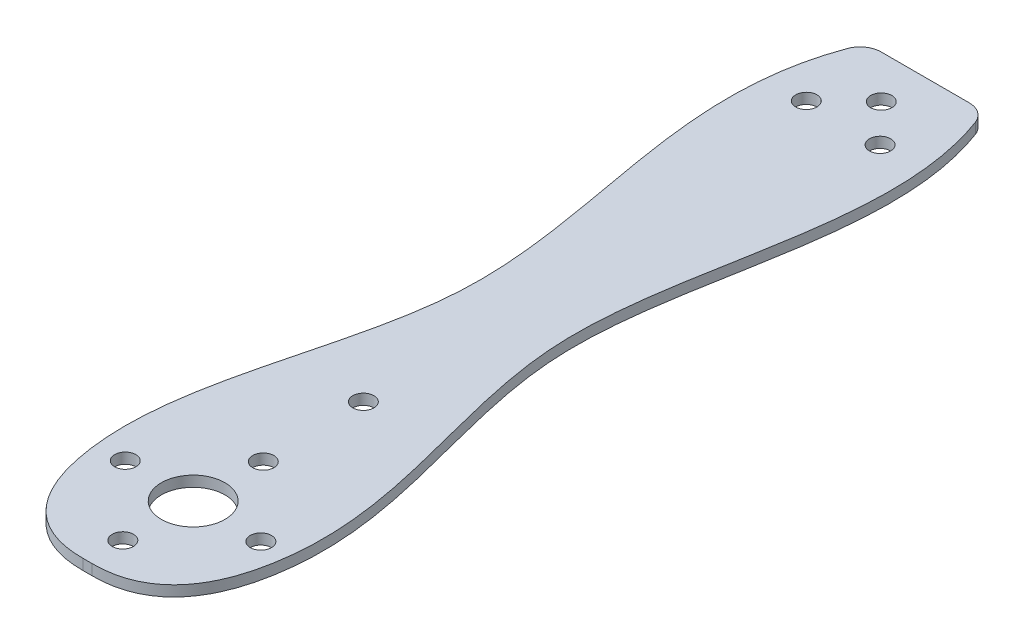
ISO-10303-21;
HEADER;
FILE_DESCRIPTION(('STEP AP214'),'2;1');
FILE_NAME('part.step','',(''),(''),'','','');
FILE_SCHEMA(('AUTOMOTIVE_DESIGN { 1 0 10303 214 1 1 1 1 }'));
ENDSEC;
DATA;
#1=APPLICATION_CONTEXT('core data for automotive mechanical design processes');
#2=APPLICATION_PROTOCOL_DEFINITION('international standard','automotive_design',2000,#1);
#3=PRODUCT_CONTEXT('',#1,'mechanical');
#4=PRODUCT('Part','Part','',(#3));
#5=PRODUCT_RELATED_PRODUCT_CATEGORY('part','',(#4));
#6=PRODUCT_DEFINITION_FORMATION('','',#4);
#7=PRODUCT_DEFINITION_CONTEXT('part definition',#1,'design');
#8=PRODUCT_DEFINITION('design','',#6,#7);
#9=PRODUCT_DEFINITION_SHAPE('','',#8);
#10=(LENGTH_UNIT() NAMED_UNIT(*) SI_UNIT(.MILLI.,.METRE.));
#11=(NAMED_UNIT(*) PLANE_ANGLE_UNIT() SI_UNIT($,.RADIAN.));
#12=(NAMED_UNIT(*) SI_UNIT($,.STERADIAN.) SOLID_ANGLE_UNIT());
#13=UNCERTAINTY_MEASURE_WITH_UNIT(LENGTH_MEASURE(1.E-05),#10,'distance_accuracy_value','');
#14=(GEOMETRIC_REPRESENTATION_CONTEXT(3) GLOBAL_UNCERTAINTY_ASSIGNED_CONTEXT((#13)) GLOBAL_UNIT_ASSIGNED_CONTEXT((#10,
#11,#12)) REPRESENTATION_CONTEXT('',''));
#15=CARTESIAN_POINT('',(0.,0.,0.));
#16=DIRECTION('',(0.,0.,1.));
#17=DIRECTION('',(1.,0.,0.));
#18=AXIS2_PLACEMENT_3D('',#15,#16,#17);
#19=CARTESIAN_POINT('',(-6.06803885959706,1.27,-35.1624595783879));
#20=DIRECTION('',(0.,1.,0.));
#21=DIRECTION('',(0.,0.,1.));
#22=AXIS2_PLACEMENT_3D('',#19,#20,#21);
#23=PLANE('',#22);
#24=CARTESIAN_POINT('',(4.29438836050923,1.27,-79.1932654626447));
#25=DIRECTION('',(0.,1.,0.));
#26=DIRECTION('',(0.,0.,1.));
#27=AXIS2_PLACEMENT_3D('',#24,#25,#26);
#28=CIRCLE('',#27,1.27000000000001);
#29=CARTESIAN_POINT('',(4.29438836050923,1.27,-77.9232654626447));
#30=VERTEX_POINT('',#29);
#31=EDGE_CURVE('E222',#30,#30,#28,.T.);
#32=ORIENTED_EDGE('',*,*,#31,.F.);
#33=EDGE_LOOP('',(#32));
#34=FACE_BOUND('',#33,.T.);
#35=CARTESIAN_POINT('',(-0.123545977320972,1.27,-83.7544447165899));
#36=DIRECTION('',(0.,1.,0.));
#37=DIRECTION('',(0.,0.,1.));
#38=AXIS2_PLACEMENT_3D('',#35,#36,#37);
#39=CIRCLE('',#38,1.27);
#40=CARTESIAN_POINT('',(-0.123545977320972,1.27,-82.4844447165899));
#41=VERTEX_POINT('',#40);
#42=EDGE_CURVE('E224',#41,#41,#39,.T.);
#43=ORIENTED_EDGE('',*,*,#42,.F.);
#44=EDGE_LOOP('',(#43));
#45=FACE_BOUND('',#44,.T.);
#46=CARTESIAN_POINT('',(-4.68472523126625,1.27,-79.3365103787597));
#47=DIRECTION('',(0.,1.,0.));
#48=DIRECTION('',(0.,0.,1.));
#49=AXIS2_PLACEMENT_3D('',#46,#47,#48);
#50=CIRCLE('',#49,1.27);
#51=CARTESIAN_POINT('',(-4.68472523126625,1.27,-78.0665103787597));
#52=VERTEX_POINT('',#51);
#53=EDGE_CURVE('E230',#52,#52,#50,.T.);
#54=ORIENTED_EDGE('',*,*,#53,.F.);
#55=EDGE_LOOP('',(#54));
#56=FACE_BOUND('',#55,.T.);
#57=CARTESIAN_POINT('',(8.35743982505473,1.27,-0.952711917850374));
#58=DIRECTION('',(0.,1.,0.));
#59=DIRECTION('',(0.,0.,1.));
#60=AXIS2_PLACEMENT_3D('',#57,#58,#59);
#61=CIRCLE('',#60,1.26999999999999);
#62=CARTESIAN_POINT('',(8.35743982505473,1.27,0.317288082149616));
#63=VERTEX_POINT('',#62);
#64=EDGE_CURVE('E247',#63,#63,#61,.F.);
#65=ORIENTED_EDGE('',*,*,#64,.T.);
#66=EDGE_LOOP('',(#65));
#67=FACE_BOUND('',#66,.T.);
#68=CARTESIAN_POINT('',(-8.15044140009905,1.27,-1.2160642005858));
#69=DIRECTION('',(0.,1.,0.));
#70=DIRECTION('',(0.,0.,1.));
#71=AXIS2_PLACEMENT_3D('',#68,#69,#70);
#72=CIRCLE('',#71,1.26999999999999);
#73=CARTESIAN_POINT('',(-8.15044140009905,1.27,0.0539357994141898));
#74=VERTEX_POINT('',#73);
#75=EDGE_CURVE('E259',#74,#74,#72,.F.);
#76=ORIENTED_EDGE('',*,*,#75,.T.);
#77=EDGE_LOOP('',(#76));
#78=FACE_BOUND('',#77,.T.);
#79=CARTESIAN_POINT('',(-7.65606789524391,1.27,-87.2435123895733));
#80=CARTESIAN_POINT('',(-8.69387878906482,1.27,-84.4462343939543));
#81=CARTESIAN_POINT('',(-11.9390396369478,1.27,-68.466563532059));
#82=CARTESIAN_POINT('',(0.65299725357168,1.27,-38.8316771182149));
#83=CARTESIAN_POINT('',(-14.645892481921,1.27,-10.8180301031043));
#84=CARTESIAN_POINT('',(-9.52942471625887,1.27,8.06677743891473));
#85=CARTESIAN_POINT('',(-4.89210551911312,1.27,11.4690429837781));
#86=CARTESIAN_POINT('',(-0.552393074181217,1.27,11.4436105730742));
#87=B_SPLINE_CURVE_WITH_KNOTS('',3,(#79,#80,#81,#82,#83,#84,#85,#86),.UNSPECIFIED.,.F.,.F.,(4,1,
1,1,1,4),(0.00386234320393917,0.0851234585111069,0.460196307042381,0.825639959486993,
0.891434804627069,0.983926161457746),.UNSPECIFIED.);
#88=CARTESIAN_POINT('',(-7.65606789524392,1.27,-87.2435123895732));
#89=VERTEX_POINT('',#88);
#90=CARTESIAN_POINT('',(-0.552393074181242,1.27,11.4436105730742));
#91=VERTEX_POINT('',#90);
#92=EDGE_CURVE('E147',#89,#91,#87,.T.);
#93=ORIENTED_EDGE('',*,*,#92,.T.);
#94=CARTESIAN_POINT('',(-0.105838966634947,1.27,87.6423020935264));
#95=DIRECTION('',(0.,-1.,0.));
#96=DIRECTION('',(0.,0.,-1.));
#97=AXIS2_PLACEMENT_3D('',#94,#95,#96);
#98=CIRCLE('',#97,76.2);
#99=CARTESIAN_POINT('',(0.546218601830818,1.27,11.4450920335288));
#100=VERTEX_POINT('',#99);
#101=EDGE_CURVE('E95',#91,#100,#98,.T.);
#102=ORIENTED_EDGE('',*,*,#101,.T.);
#103=CARTESIAN_POINT('',(0.546218601830835,1.27,11.4450920335288));
#104=CARTESIAN_POINT('',(4.70564238176043,1.27,11.4806862994347));
#105=CARTESIAN_POINT('',(9.42694829545164,1.27,8.18559067277081));
#106=CARTESIAN_POINT('',(14.781899316302,1.27,-10.7253531590796));
#107=CARTESIAN_POINT('',(-0.687433656179139,1.27,-38.8280616688015));
#108=CARTESIAN_POINT('',(11.9385019341177,1.27,-68.4663847661485));
#109=CARTESIAN_POINT('',(8.69498743315101,1.27,-84.446805863533));
#110=CARTESIAN_POINT('',(7.65640401432154,1.27,-87.2440889836292));
#111=B_SPLINE_CURVE_WITH_KNOTS('',3,(#103,#104,#105,#106,#107,#108,#109,#110),.UNSPECIFIED.,.F.,
.F.,(4,1,1,1,1,4),(0.00386753084614057,0.0936136126892382,0.162313611856081,0.527685276656768,
0.902684240717795,0.983933930571838),.UNSPECIFIED.);
#112=CARTESIAN_POINT('',(7.65640401432154,1.27,-87.2440889836292));
#113=VERTEX_POINT('',#112);
#114=EDGE_CURVE('E108',#100,#113,#111,.T.);
#115=ORIENTED_EDGE('',*,*,#114,.T.);
#116=CARTESIAN_POINT('',(5.27523063360656,1.27,-86.36));
#117=DIRECTION('',(0.,1.,0.));
#118=DIRECTION('',(0.,0.,1.));
#119=AXIS2_PLACEMENT_3D('',#116,#117,#118);
#120=CIRCLE('',#119,2.54);
#121=CARTESIAN_POINT('',(5.27523063360639,1.27,-88.9));
#122=VERTEX_POINT('',#121);
#123=EDGE_CURVE('E102',#113,#122,#120,.T.);
#124=ORIENTED_EDGE('',*,*,#123,.T.);
#125=DIRECTION('',(-1.,0.,0.));
#126=VECTOR('',#125,1.);
#127=CARTESIAN_POINT('',(5.27523063360639,1.27,-88.9));
#128=LINE('',#127,#126);
#129=CARTESIAN_POINT('',(-5.27468051443613,1.27,-88.9));
#130=VERTEX_POINT('',#129);
#131=EDGE_CURVE('E106',#122,#130,#128,.T.);
#132=ORIENTED_EDGE('',*,*,#131,.T.);
#133=CARTESIAN_POINT('',(-5.27468051443612,1.27,-86.36));
#134=DIRECTION('',(0.,1.,0.));
#135=DIRECTION('',(0.,0.,1.));
#136=AXIS2_PLACEMENT_3D('',#133,#134,#135);
#137=CIRCLE('',#136,2.54);
#138=EDGE_CURVE('E58',#130,#89,#137,.T.);
#139=ORIENTED_EDGE('',*,*,#138,.T.);
#140=EDGE_LOOP('',(#93,#102,#115,#124,#132,#139));
#141=FACE_BOUND('',#140,.T.);
#142=CARTESIAN_POINT('',(0.,1.27,-21.59));
#143=DIRECTION('',(0.,1.,0.));
#144=DIRECTION('',(0.,0.,1.));
#145=AXIS2_PLACEMENT_3D('',#142,#143,#144);
#146=CIRCLE('',#145,1.27);
#147=CARTESIAN_POINT('',(0.,1.27,-20.32));
#148=VERTEX_POINT('',#147);
#149=EDGE_CURVE('E268',#148,#148,#146,.T.);
#150=ORIENTED_EDGE('',*,*,#149,.F.);
#151=EDGE_LOOP('',(#150));
#152=FACE_BOUND('',#151,.T.);
#153=CARTESIAN_POINT('',(0.211318445172942,1.27,-9.3895914127316));
#154=DIRECTION('',(0.,1.,0.));
#155=DIRECTION('',(0.,0.,1.));
#156=AXIS2_PLACEMENT_3D('',#153,#154,#155);
#157=CIRCLE('',#156,1.27);
#158=CARTESIAN_POINT('',(0.211318445172942,1.27,-8.11959141273161));
#159=VERTEX_POINT('',#158);
#160=EDGE_CURVE('E265',#159,#159,#157,.F.);
#161=ORIENTED_EDGE('',*,*,#160,.T.);
#162=EDGE_LOOP('',(#161));
#163=FACE_BOUND('',#162,.T.);
#164=CARTESIAN_POINT('',(0.103695065582152,1.27,-1.09666484584763));
#165=DIRECTION('',(0.,1.,0.));
#166=DIRECTION('',(0.,0.,1.));
#167=AXIS2_PLACEMENT_3D('',#164,#165,#166);
#168=CIRCLE('',#167,3.81);
#169=CARTESIAN_POINT('',(0.103695065582152,1.27,2.71333515415237));
#170=VERTEX_POINT('',#169);
#171=EDGE_CURVE('E253',#170,#170,#168,.F.);
#172=ORIENTED_EDGE('',*,*,#171,.T.);
#173=EDGE_LOOP('',(#172));
#174=FACE_BOUND('',#173,.T.);
#175=CARTESIAN_POINT('',(-0.028597330738192,1.27,7.19590487393408));
#176=DIRECTION('',(0.,1.,0.));
#177=DIRECTION('',(0.,0.,1.));
#178=AXIS2_PLACEMENT_3D('',#175,#176,#177);
#179=CIRCLE('',#178,1.26999999999999);
#180=CARTESIAN_POINT('',(-0.028597330738192,1.27,8.46590487393407));
#181=VERTEX_POINT('',#180);
#182=EDGE_CURVE('E241',#181,#181,#179,.F.);
#183=ORIENTED_EDGE('',*,*,#182,.T.);
#184=EDGE_LOOP('',(#183));
#185=FACE_BOUND('',#184,.T.);
#186=ADVANCED_FACE('F40',(#34,#45,#56,#67,#78,#141,#152,#163,#174,#185),#23,.T.);
#187=CARTESIAN_POINT('',(-6.06803885959706,0.,-35.1624595783879));
#188=DIRECTION('',(0.,1.,0.));
#189=DIRECTION('',(0.,0.,1.));
#190=AXIS2_PLACEMENT_3D('',#187,#188,#189);
#191=PLANE('',#190);
#192=CARTESIAN_POINT('',(4.29438836050923,0.,-79.1932654626447));
#193=DIRECTION('',(0.,1.,0.));
#194=DIRECTION('',(0.,0.,1.));
#195=AXIS2_PLACEMENT_3D('',#192,#193,#194);
#196=CIRCLE('',#195,1.27000000000001);
#197=CARTESIAN_POINT('',(4.29438836050923,0.,-77.9232654626447));
#198=VERTEX_POINT('',#197);
#199=EDGE_CURVE('E220',#198,#198,#196,.T.);
#200=ORIENTED_EDGE('',*,*,#199,.T.);
#201=EDGE_LOOP('',(#200));
#202=FACE_BOUND('',#201,.T.);
#203=CARTESIAN_POINT('',(-0.123545977320972,0.,-83.7544447165899));
#204=DIRECTION('',(0.,1.,0.));
#205=DIRECTION('',(0.,0.,1.));
#206=AXIS2_PLACEMENT_3D('',#203,#204,#205);
#207=CIRCLE('',#206,1.27);
#208=CARTESIAN_POINT('',(-0.123545977320972,0.,-82.4844447165899));
#209=VERTEX_POINT('',#208);
#210=EDGE_CURVE('E227',#209,#209,#207,.T.);
#211=ORIENTED_EDGE('',*,*,#210,.T.);
#212=EDGE_LOOP('',(#211));
#213=FACE_BOUND('',#212,.T.);
#214=CARTESIAN_POINT('',(-4.68472523126625,0.,-79.3365103787597));
#215=DIRECTION('',(0.,1.,0.));
#216=DIRECTION('',(0.,0.,1.));
#217=AXIS2_PLACEMENT_3D('',#214,#215,#216);
#218=CIRCLE('',#217,1.27);
#219=CARTESIAN_POINT('',(-4.68472523126625,0.,-78.0665103787597));
#220=VERTEX_POINT('',#219);
#221=EDGE_CURVE('E233',#220,#220,#218,.T.);
#222=ORIENTED_EDGE('',*,*,#221,.T.);
#223=EDGE_LOOP('',(#222));
#224=FACE_BOUND('',#223,.T.);
#225=CARTESIAN_POINT('',(8.35743982505473,0.,-0.952711917850374));
#226=DIRECTION('',(0.,1.,0.));
#227=DIRECTION('',(0.,0.,1.));
#228=AXIS2_PLACEMENT_3D('',#225,#226,#227);
#229=CIRCLE('',#228,1.26999999999999);
#230=CARTESIAN_POINT('',(8.35743982505473,0.,0.317288082149616));
#231=VERTEX_POINT('',#230);
#232=EDGE_CURVE('E244',#231,#231,#229,.T.);
#233=ORIENTED_EDGE('',*,*,#232,.T.);
#234=EDGE_LOOP('',(#233));
#235=FACE_BOUND('',#234,.T.);
#236=CARTESIAN_POINT('',(-8.15044140009905,0.,-1.2160642005858));
#237=DIRECTION('',(0.,1.,0.));
#238=DIRECTION('',(0.,0.,1.));
#239=AXIS2_PLACEMENT_3D('',#236,#237,#238);
#240=CIRCLE('',#239,1.26999999999999);
#241=CARTESIAN_POINT('',(-8.15044140009905,0.,0.0539357994141898));
#242=VERTEX_POINT('',#241);
#243=EDGE_CURVE('E256',#242,#242,#240,.T.);
#244=ORIENTED_EDGE('',*,*,#243,.T.);
#245=EDGE_LOOP('',(#244));
#246=FACE_BOUND('',#245,.T.);
#247=CARTESIAN_POINT('',(-7.65606789524391,0.,-87.2435123895733));
#248=CARTESIAN_POINT('',(-8.69387878906482,0.,-84.4462343939543));
#249=CARTESIAN_POINT('',(-11.9390396369478,0.,-68.466563532059));
#250=CARTESIAN_POINT('',(0.65299725357168,0.,-38.8316771182149));
#251=CARTESIAN_POINT('',(-14.645892481921,0.,-10.8180301031043));
#252=CARTESIAN_POINT('',(-9.52942471625887,0.,8.06677743891473));
#253=CARTESIAN_POINT('',(-4.89210551911312,0.,11.4690429837781));
#254=CARTESIAN_POINT('',(-0.552393074181217,0.,11.4436105730742));
#255=B_SPLINE_CURVE_WITH_KNOTS('',3,(#247,#248,#249,#250,#251,#252,#253,#254),.UNSPECIFIED.,.F.,
.F.,(4,1,1,1,1,4),(0.00386234320393917,0.0851234585111069,0.460196307042381,0.825639959486993,
0.891434804627069,0.983926161457746),.UNSPECIFIED.);
#256=CARTESIAN_POINT('',(-7.65606789524392,0.,-87.2435123895732));
#257=VERTEX_POINT('',#256);
#258=CARTESIAN_POINT('',(-0.552393074181242,0.,11.4436105730742));
#259=VERTEX_POINT('',#258);
#260=EDGE_CURVE('E126',#257,#259,#255,.T.);
#261=ORIENTED_EDGE('',*,*,#260,.F.);
#262=CARTESIAN_POINT('',(-5.27468051443612,0.,-86.36));
#263=DIRECTION('',(0.,1.,0.));
#264=DIRECTION('',(0.,0.,1.));
#265=AXIS2_PLACEMENT_3D('',#262,#263,#264);
#266=CIRCLE('',#265,2.54);
#267=CARTESIAN_POINT('',(-5.27468051443613,0.,-88.9));
#268=VERTEX_POINT('',#267);
#269=EDGE_CURVE('E87',#268,#257,#266,.T.);
#270=ORIENTED_EDGE('',*,*,#269,.F.);
#271=DIRECTION('',(-1.,0.,0.));
#272=VECTOR('',#271,1.);
#273=CARTESIAN_POINT('',(5.27523063360639,0.,-88.9));
#274=LINE('',#273,#272);
#275=CARTESIAN_POINT('',(5.27523063360639,0.,-88.9));
#276=VERTEX_POINT('',#275);
#277=EDGE_CURVE('E81',#276,#268,#274,.T.);
#278=ORIENTED_EDGE('',*,*,#277,.F.);
#279=CARTESIAN_POINT('',(5.27523063360656,0.,-86.36));
#280=DIRECTION('',(0.,1.,0.));
#281=DIRECTION('',(0.,0.,1.));
#282=AXIS2_PLACEMENT_3D('',#279,#280,#281);
#283=CIRCLE('',#282,2.54);
#284=CARTESIAN_POINT('',(7.65640401432154,0.,-87.2440889836292));
#285=VERTEX_POINT('',#284);
#286=EDGE_CURVE('E116',#285,#276,#283,.T.);
#287=ORIENTED_EDGE('',*,*,#286,.F.);
#288=CARTESIAN_POINT('',(0.546218601830835,0.,11.4450920335288));
#289=CARTESIAN_POINT('',(4.70564238176043,0.,11.4806862994347));
#290=CARTESIAN_POINT('',(9.42694829545164,0.,8.18559067277081));
#291=CARTESIAN_POINT('',(14.781899316302,0.,-10.7253531590796));
#292=CARTESIAN_POINT('',(-0.687433656179139,0.,-38.8280616688015));
#293=CARTESIAN_POINT('',(11.9385019341177,0.,-68.4663847661485));
#294=CARTESIAN_POINT('',(8.69498743315101,0.,-84.446805863533));
#295=CARTESIAN_POINT('',(7.65640401432154,0.,-87.2440889836292));
#296=B_SPLINE_CURVE_WITH_KNOTS('',3,(#288,#289,#290,#291,#292,#293,#294,#295),.UNSPECIFIED.,.F.,
.F.,(4,1,1,1,1,4),(0.00386753084614057,0.0936136126892382,0.162313611856081,0.527685276656768,
0.902684240717795,0.983933930571838),.UNSPECIFIED.);
#297=CARTESIAN_POINT('',(0.546218601830818,0.,11.4450920335288));
#298=VERTEX_POINT('',#297);
#299=EDGE_CURVE('E137',#298,#285,#296,.T.);
#300=ORIENTED_EDGE('',*,*,#299,.F.);
#301=CARTESIAN_POINT('',(-0.105838966634947,0.,87.6423020935264));
#302=DIRECTION('',(0.,-1.,0.));
#303=DIRECTION('',(0.,0.,-1.));
#304=AXIS2_PLACEMENT_3D('',#301,#302,#303);
#305=CIRCLE('',#304,76.2);
#306=EDGE_CURVE('E131',#259,#298,#305,.T.);
#307=ORIENTED_EDGE('',*,*,#306,.F.);
#308=EDGE_LOOP('',(#261,#270,#278,#287,#300,#307));
#309=FACE_BOUND('',#308,.T.);
#310=CARTESIAN_POINT('',(0.,0.,-21.59));
#311=DIRECTION('',(0.,1.,0.));
#312=DIRECTION('',(0.,0.,1.));
#313=AXIS2_PLACEMENT_3D('',#310,#311,#312);
#314=CIRCLE('',#313,1.27);
#315=CARTESIAN_POINT('',(0.,0.,-20.32));
#316=VERTEX_POINT('',#315);
#317=EDGE_CURVE('E132',#316,#316,#314,.T.);
#318=ORIENTED_EDGE('',*,*,#317,.T.);
#319=EDGE_LOOP('',(#318));
#320=FACE_BOUND('',#319,.T.);
#321=CARTESIAN_POINT('',(0.211318445172942,0.,-9.3895914127316));
#322=DIRECTION('',(0.,1.,0.));
#323=DIRECTION('',(0.,0.,1.));
#324=AXIS2_PLACEMENT_3D('',#321,#322,#323);
#325=CIRCLE('',#324,1.27);
#326=CARTESIAN_POINT('',(0.211318445172942,0.,-8.11959141273161));
#327=VERTEX_POINT('',#326);
#328=EDGE_CURVE('E262',#327,#327,#325,.T.);
#329=ORIENTED_EDGE('',*,*,#328,.T.);
#330=EDGE_LOOP('',(#329));
#331=FACE_BOUND('',#330,.T.);
#332=CARTESIAN_POINT('',(0.103695065582152,0.,-1.09666484584763));
#333=DIRECTION('',(0.,1.,0.));
#334=DIRECTION('',(0.,0.,1.));
#335=AXIS2_PLACEMENT_3D('',#332,#333,#334);
#336=CIRCLE('',#335,3.81);
#337=CARTESIAN_POINT('',(0.103695065582152,0.,2.71333515415237));
#338=VERTEX_POINT('',#337);
#339=EDGE_CURVE('E250',#338,#338,#336,.T.);
#340=ORIENTED_EDGE('',*,*,#339,.T.);
#341=EDGE_LOOP('',(#340));
#342=FACE_BOUND('',#341,.T.);
#343=CARTESIAN_POINT('',(-0.028597330738192,0.,7.19590487393408));
#344=DIRECTION('',(0.,1.,0.));
#345=DIRECTION('',(0.,0.,1.));
#346=AXIS2_PLACEMENT_3D('',#343,#344,#345);
#347=CIRCLE('',#346,1.26999999999999);
#348=CARTESIAN_POINT('',(-0.028597330738192,0.,8.46590487393407));
#349=VERTEX_POINT('',#348);
#350=EDGE_CURVE('E236',#349,#349,#347,.T.);
#351=ORIENTED_EDGE('',*,*,#350,.T.);
#352=EDGE_LOOP('',(#351));
#353=FACE_BOUND('',#352,.T.);
#354=ADVANCED_FACE('F156',(#202,#213,#224,#235,#246,#309,#320,#331,#342,#353),#191,.F.);
#355=DIRECTION('',(0.,-1.,0.));
#356=VECTOR('',#355,1.);
#357=SURFACE_OF_LINEAR_EXTRUSION('',#87,#356);
#358=ORIENTED_EDGE('',*,*,#260,.T.);
#359=DIRECTION('',(0.,-1.,0.));
#360=VECTOR('',#359,1.);
#361=CARTESIAN_POINT('',(-0.552393074181242,1.27,11.4436105730742));
#362=LINE('',#361,#360);
#363=EDGE_CURVE('E12',#91,#259,#362,.T.);
#364=ORIENTED_EDGE('',*,*,#363,.F.);
#365=ORIENTED_EDGE('',*,*,#92,.F.);
#366=DIRECTION('',(0.,-1.,0.));
#367=VECTOR('',#366,1.);
#368=CARTESIAN_POINT('',(-7.65606789524392,1.27,-87.2435123895732));
#369=LINE('',#368,#367);
#370=EDGE_CURVE('E122',#89,#257,#369,.T.);
#371=ORIENTED_EDGE('',*,*,#370,.T.);
#372=EDGE_LOOP('',(#358,#364,#365,#371));
#373=FACE_BOUND('',#372,.T.);
#374=ADVANCED_FACE('F42',(#373),#357,.F.);
#375=CARTESIAN_POINT('',(-0.105838966634947,1.27,87.6423020935264));
#376=DIRECTION('',(0.,-1.,0.));
#377=DIRECTION('',(0.,0.,-1.));
#378=AXIS2_PLACEMENT_3D('',#375,#376,#377);
#379=CYLINDRICAL_SURFACE('',#378,76.2);
#380=ORIENTED_EDGE('',*,*,#306,.T.);
#381=DIRECTION('',(0.,-1.,0.));
#382=VECTOR('',#381,1.);
#383=CARTESIAN_POINT('',(0.546218601830818,1.27,11.4450920335288));
#384=LINE('',#383,#382);
#385=EDGE_CURVE('E50',#100,#298,#384,.T.);
#386=ORIENTED_EDGE('',*,*,#385,.F.);
#387=ORIENTED_EDGE('',*,*,#101,.F.);
#388=ORIENTED_EDGE('',*,*,#363,.T.);
#389=EDGE_LOOP('',(#380,#386,#387,#388));
#390=FACE_BOUND('',#389,.T.);
#391=ADVANCED_FACE('F288',(#390),#379,.F.);
#392=DIRECTION('',(0.,-1.,0.));
#393=VECTOR('',#392,1.);
#394=SURFACE_OF_LINEAR_EXTRUSION('',#111,#393);
#395=ORIENTED_EDGE('',*,*,#299,.T.);
#396=DIRECTION('',(0.,-1.,0.));
#397=VECTOR('',#396,1.);
#398=CARTESIAN_POINT('',(7.65640401432154,1.27,-87.2440889836292));
#399=LINE('',#398,#397);
#400=EDGE_CURVE('E117',#113,#285,#399,.T.);
#401=ORIENTED_EDGE('',*,*,#400,.F.);
#402=ORIENTED_EDGE('',*,*,#114,.F.);
#403=ORIENTED_EDGE('',*,*,#385,.T.);
#404=EDGE_LOOP('',(#395,#401,#402,#403));
#405=FACE_BOUND('',#404,.T.);
#406=ADVANCED_FACE('F153',(#405),#394,.F.);
#407=CARTESIAN_POINT('',(5.27523063360656,1.27,-86.36));
#408=DIRECTION('',(0.,-1.,0.));
#409=DIRECTION('',(0.,0.,-1.));
#410=AXIS2_PLACEMENT_3D('',#407,#408,#409);
#411=CYLINDRICAL_SURFACE('',#410,2.54);
#412=ORIENTED_EDGE('',*,*,#286,.T.);
#413=DIRECTION('',(0.,-1.,0.));
#414=VECTOR('',#413,1.);
#415=CARTESIAN_POINT('',(5.27523063360639,1.27,-88.9));
#416=LINE('',#415,#414);
#417=EDGE_CURVE('E113',#122,#276,#416,.T.);
#418=ORIENTED_EDGE('',*,*,#417,.F.);
#419=ORIENTED_EDGE('',*,*,#123,.F.);
#420=ORIENTED_EDGE('',*,*,#400,.T.);
#421=EDGE_LOOP('',(#412,#418,#419,#420));
#422=FACE_BOUND('',#421,.T.);
#423=ADVANCED_FACE('F114',(#422),#411,.T.);
#424=CARTESIAN_POINT('',(5.27523063360639,1.27,-88.9));
#425=DIRECTION('',(0.,0.,1.));
#426=DIRECTION('',(1.,0.,0.));
#427=AXIS2_PLACEMENT_3D('',#424,#425,#426);
#428=PLANE('',#427);
#429=ORIENTED_EDGE('',*,*,#277,.T.);
#430=DIRECTION('',(0.,-1.,0.));
#431=VECTOR('',#430,1.);
#432=CARTESIAN_POINT('',(-5.27468051443613,1.27,-88.9));
#433=LINE('',#432,#431);
#434=EDGE_CURVE('E118',#130,#268,#433,.T.);
#435=ORIENTED_EDGE('',*,*,#434,.F.);
#436=ORIENTED_EDGE('',*,*,#131,.F.);
#437=ORIENTED_EDGE('',*,*,#417,.T.);
#438=EDGE_LOOP('',(#429,#435,#436,#437));
#439=FACE_BOUND('',#438,.T.);
#440=ADVANCED_FACE('F120',(#439),#428,.F.);
#441=CARTESIAN_POINT('',(-5.27468051443612,1.27,-86.36));
#442=DIRECTION('',(0.,-1.,0.));
#443=DIRECTION('',(0.,0.,-1.));
#444=AXIS2_PLACEMENT_3D('',#441,#442,#443);
#445=CYLINDRICAL_SURFACE('',#444,2.54);
#446=ORIENTED_EDGE('',*,*,#269,.T.);
#447=ORIENTED_EDGE('',*,*,#370,.F.);
#448=ORIENTED_EDGE('',*,*,#138,.F.);
#449=ORIENTED_EDGE('',*,*,#434,.T.);
#450=EDGE_LOOP('',(#446,#447,#448,#449));
#451=FACE_BOUND('',#450,.T.);
#452=ADVANCED_FACE('F161',(#451),#445,.T.);
#453=CARTESIAN_POINT('',(0.,0.,-21.59));
#454=DIRECTION('',(0.,1.,0.));
#455=DIRECTION('',(0.,0.,1.));
#456=AXIS2_PLACEMENT_3D('',#453,#454,#455);
#457=CYLINDRICAL_SURFACE('',#456,1.27);
#458=ORIENTED_EDGE('',*,*,#317,.F.);
#459=EDGE_LOOP('',(#458));
#460=FACE_BOUND('',#459,.T.);
#461=ORIENTED_EDGE('',*,*,#149,.T.);
#462=EDGE_LOOP('',(#461));
#463=FACE_BOUND('',#462,.T.);
#464=ADVANCED_FACE('F163',(#460,#463),#457,.F.);
#465=CARTESIAN_POINT('',(0.211318445172942,3.81,-9.3895914127316));
#466=DIRECTION('',(0.,-1.,0.));
#467=DIRECTION('',(0.,0.,-1.));
#468=AXIS2_PLACEMENT_3D('',#465,#466,#467);
#469=CYLINDRICAL_SURFACE('',#468,1.27);
#470=ORIENTED_EDGE('',*,*,#160,.F.);
#471=EDGE_LOOP('',(#470));
#472=FACE_BOUND('',#471,.T.);
#473=ORIENTED_EDGE('',*,*,#328,.F.);
#474=EDGE_LOOP('',(#473));
#475=FACE_BOUND('',#474,.T.);
#476=ADVANCED_FACE('F169',(#472,#475),#469,.F.);
#477=CARTESIAN_POINT('',(-8.15044140009905,3.81,-1.2160642005858));
#478=DIRECTION('',(0.,-1.,0.));
#479=DIRECTION('',(0.,0.,-1.));
#480=AXIS2_PLACEMENT_3D('',#477,#478,#479);
#481=CYLINDRICAL_SURFACE('',#480,1.26999999999999);
#482=ORIENTED_EDGE('',*,*,#75,.F.);
#483=EDGE_LOOP('',(#482));
#484=FACE_BOUND('',#483,.T.);
#485=ORIENTED_EDGE('',*,*,#243,.F.);
#486=EDGE_LOOP('',(#485));
#487=FACE_BOUND('',#486,.T.);
#488=ADVANCED_FACE('F187',(#484,#487),#481,.F.);
#489=CARTESIAN_POINT('',(0.103695065582152,3.81,-1.09666484584763));
#490=DIRECTION('',(0.,-1.,0.));
#491=DIRECTION('',(0.,0.,-1.));
#492=AXIS2_PLACEMENT_3D('',#489,#490,#491);
#493=CYLINDRICAL_SURFACE('',#492,3.81);
#494=ORIENTED_EDGE('',*,*,#171,.F.);
#495=EDGE_LOOP('',(#494));
#496=FACE_BOUND('',#495,.T.);
#497=ORIENTED_EDGE('',*,*,#339,.F.);
#498=EDGE_LOOP('',(#497));
#499=FACE_BOUND('',#498,.T.);
#500=ADVANCED_FACE('F191',(#496,#499),#493,.F.);
#501=CARTESIAN_POINT('',(8.35743982505473,3.81,-0.952711917850374));
#502=DIRECTION('',(0.,-1.,0.));
#503=DIRECTION('',(0.,0.,-1.));
#504=AXIS2_PLACEMENT_3D('',#501,#502,#503);
#505=CYLINDRICAL_SURFACE('',#504,1.26999999999999);
#506=ORIENTED_EDGE('',*,*,#64,.F.);
#507=EDGE_LOOP('',(#506));
#508=FACE_BOUND('',#507,.T.);
#509=ORIENTED_EDGE('',*,*,#232,.F.);
#510=EDGE_LOOP('',(#509));
#511=FACE_BOUND('',#510,.T.);
#512=ADVANCED_FACE('F195',(#508,#511),#505,.F.);
#513=CARTESIAN_POINT('',(-0.028597330738192,3.81,7.19590487393408));
#514=DIRECTION('',(0.,-1.,0.));
#515=DIRECTION('',(0.,0.,-1.));
#516=AXIS2_PLACEMENT_3D('',#513,#514,#515);
#517=CYLINDRICAL_SURFACE('',#516,1.26999999999999);
#518=ORIENTED_EDGE('',*,*,#182,.F.);
#519=EDGE_LOOP('',(#518));
#520=FACE_BOUND('',#519,.T.);
#521=ORIENTED_EDGE('',*,*,#350,.F.);
#522=EDGE_LOOP('',(#521));
#523=FACE_BOUND('',#522,.T.);
#524=ADVANCED_FACE('F199',(#520,#523),#517,.F.);
#525=CARTESIAN_POINT('',(-4.68472523126625,0.,-79.3365103787597));
#526=DIRECTION('',(0.,1.,0.));
#527=DIRECTION('',(0.,0.,1.));
#528=AXIS2_PLACEMENT_3D('',#525,#526,#527);
#529=CYLINDRICAL_SURFACE('',#528,1.27);
#530=ORIENTED_EDGE('',*,*,#221,.F.);
#531=EDGE_LOOP('',(#530));
#532=FACE_BOUND('',#531,.T.);
#533=ORIENTED_EDGE('',*,*,#53,.T.);
#534=EDGE_LOOP('',(#533));
#535=FACE_BOUND('',#534,.T.);
#536=ADVANCED_FACE('F203',(#532,#535),#529,.F.);
#537=CARTESIAN_POINT('',(-0.123545977320972,0.,-83.7544447165899));
#538=DIRECTION('',(0.,1.,0.));
#539=DIRECTION('',(0.,0.,1.));
#540=AXIS2_PLACEMENT_3D('',#537,#538,#539);
#541=CYLINDRICAL_SURFACE('',#540,1.27);
#542=ORIENTED_EDGE('',*,*,#210,.F.);
#543=EDGE_LOOP('',(#542));
#544=FACE_BOUND('',#543,.T.);
#545=ORIENTED_EDGE('',*,*,#42,.T.);
#546=EDGE_LOOP('',(#545));
#547=FACE_BOUND('',#546,.T.);
#548=ADVANCED_FACE('F207',(#544,#547),#541,.F.);
#549=CARTESIAN_POINT('',(4.29438836050923,0.,-79.1932654626447));
#550=DIRECTION('',(0.,1.,0.));
#551=DIRECTION('',(0.,0.,1.));
#552=AXIS2_PLACEMENT_3D('',#549,#550,#551);
#553=CYLINDRICAL_SURFACE('',#552,1.27000000000001);
#554=ORIENTED_EDGE('',*,*,#199,.F.);
#555=EDGE_LOOP('',(#554));
#556=FACE_BOUND('',#555,.T.);
#557=ORIENTED_EDGE('',*,*,#31,.T.);
#558=EDGE_LOOP('',(#557));
#559=FACE_BOUND('',#558,.T.);
#560=ADVANCED_FACE('F211',(#556,#559),#553,.F.);
#561=CLOSED_SHELL('',(#186,#354,#374,#391,#406,#423,#440,#452,#464,#476,#488,#500,#512,#524,
#536,#548,#560));
#562=MANIFOLD_SOLID_BREP('B2',#561);
#563=ADVANCED_BREP_SHAPE_REPRESENTATION('',(#18,#562),#14);
#564=SHAPE_DEFINITION_REPRESENTATION(#9,#563);
ENDSEC;
END-ISO-10303-21;
